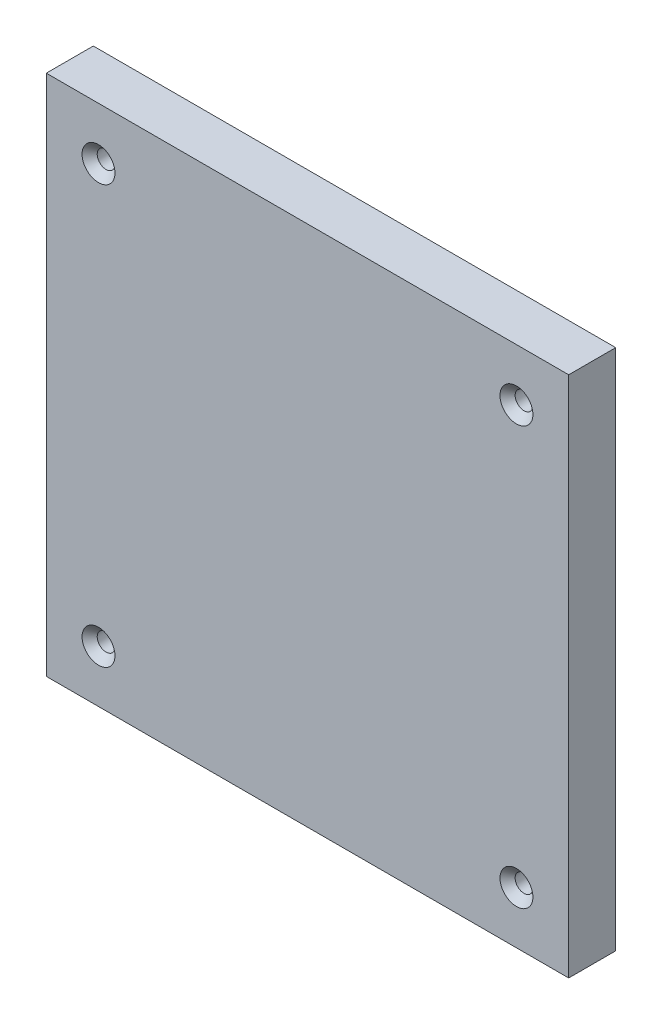
ISO-10303-21;
HEADER;
FILE_DESCRIPTION(('STEP AP214'),'2;1');
FILE_NAME('part.step','',(''),(''),'','','');
FILE_SCHEMA(('AUTOMOTIVE_DESIGN { 1 0 10303 214 1 1 1 1 }'));
ENDSEC;
DATA;
#1=APPLICATION_CONTEXT('core data for automotive mechanical design processes');
#2=APPLICATION_PROTOCOL_DEFINITION('international standard','automotive_design',2000,#1);
#3=PRODUCT_CONTEXT('',#1,'mechanical');
#4=PRODUCT('Part','Part','',(#3));
#5=PRODUCT_RELATED_PRODUCT_CATEGORY('part','',(#4));
#6=PRODUCT_DEFINITION_FORMATION('','',#4);
#7=PRODUCT_DEFINITION_CONTEXT('part definition',#1,'design');
#8=PRODUCT_DEFINITION('design','',#6,#7);
#9=PRODUCT_DEFINITION_SHAPE('','',#8);
#10=(LENGTH_UNIT() NAMED_UNIT(*) SI_UNIT(.MILLI.,.METRE.));
#11=(NAMED_UNIT(*) PLANE_ANGLE_UNIT() SI_UNIT($,.RADIAN.));
#12=(NAMED_UNIT(*) SI_UNIT($,.STERADIAN.) SOLID_ANGLE_UNIT());
#13=UNCERTAINTY_MEASURE_WITH_UNIT(LENGTH_MEASURE(1.E-05),#10,'distance_accuracy_value','');
#14=(GEOMETRIC_REPRESENTATION_CONTEXT(3) GLOBAL_UNCERTAINTY_ASSIGNED_CONTEXT((#13)) GLOBAL_UNIT_ASSIGNED_CONTEXT((#10,
#11,#12)) REPRESENTATION_CONTEXT('',''));
#15=CARTESIAN_POINT('',(0.,0.,0.));
#16=DIRECTION('',(0.,0.,1.));
#17=DIRECTION('',(1.,0.,0.));
#18=AXIS2_PLACEMENT_3D('',#15,#16,#17);
#19=CARTESIAN_POINT('',(50.,50.,9.));
#20=DIRECTION('',(-1.,0.,0.));
#21=DIRECTION('',(0.,-1.,0.));
#22=AXIS2_PLACEMENT_3D('',#19,#20,#21);
#23=PLANE('',#22);
#24=DIRECTION('',(0.,1.,0.));
#25=VECTOR('',#24,1.);
#26=CARTESIAN_POINT('',(50.,50.,0.));
#27=LINE('',#26,#25);
#28=CARTESIAN_POINT('',(50.,-50.,0.));
#29=VERTEX_POINT('',#28);
#30=CARTESIAN_POINT('',(50.,50.,0.));
#31=VERTEX_POINT('',#30);
#32=EDGE_CURVE('E114',#29,#31,#27,.T.);
#33=ORIENTED_EDGE('',*,*,#32,.T.);
#34=DIRECTION('',(0.,0.,-1.));
#35=VECTOR('',#34,1.);
#36=CARTESIAN_POINT('',(50.,50.,9.));
#37=LINE('',#36,#35);
#38=CARTESIAN_POINT('',(50.,50.,9.));
#39=VERTEX_POINT('',#38);
#40=EDGE_CURVE('E11',#39,#31,#37,.T.);
#41=ORIENTED_EDGE('',*,*,#40,.F.);
#42=DIRECTION('',(0.,1.,0.));
#43=VECTOR('',#42,1.);
#44=CARTESIAN_POINT('',(50.,50.,9.));
#45=LINE('',#44,#43);
#46=CARTESIAN_POINT('',(50.,-50.,9.));
#47=VERTEX_POINT('',#46);
#48=EDGE_CURVE('E98',#47,#39,#45,.T.);
#49=ORIENTED_EDGE('',*,*,#48,.F.);
#50=DIRECTION('',(0.,0.,-1.));
#51=VECTOR('',#50,1.);
#52=CARTESIAN_POINT('',(50.,-50.,9.));
#53=LINE('',#52,#51);
#54=EDGE_CURVE('E110',#47,#29,#53,.T.);
#55=ORIENTED_EDGE('',*,*,#54,.T.);
#56=EDGE_LOOP('',(#33,#41,#49,#55));
#57=FACE_BOUND('',#56,.T.);
#58=ADVANCED_FACE('F46',(#57),#23,.F.);
#59=CARTESIAN_POINT('',(-50.,50.,9.));
#60=DIRECTION('',(0.,-1.,0.));
#61=DIRECTION('',(0.,0.,-1.));
#62=AXIS2_PLACEMENT_3D('',#59,#60,#61);
#63=PLANE('',#62);
#64=DIRECTION('',(-1.,0.,0.));
#65=VECTOR('',#64,1.);
#66=CARTESIAN_POINT('',(-50.,50.,0.));
#67=LINE('',#66,#65);
#68=CARTESIAN_POINT('',(-50.,50.,0.));
#69=VERTEX_POINT('',#68);
#70=EDGE_CURVE('E103',#31,#69,#67,.T.);
#71=ORIENTED_EDGE('',*,*,#70,.T.);
#72=DIRECTION('',(0.,0.,-1.));
#73=VECTOR('',#72,1.);
#74=CARTESIAN_POINT('',(-50.,50.,9.));
#75=LINE('',#74,#73);
#76=CARTESIAN_POINT('',(-50.,50.,9.));
#77=VERTEX_POINT('',#76);
#78=EDGE_CURVE('E55',#77,#69,#75,.T.);
#79=ORIENTED_EDGE('',*,*,#78,.F.);
#80=DIRECTION('',(-1.,0.,0.));
#81=VECTOR('',#80,1.);
#82=CARTESIAN_POINT('',(-50.,50.,9.));
#83=LINE('',#82,#81);
#84=EDGE_CURVE('E93',#39,#77,#83,.T.);
#85=ORIENTED_EDGE('',*,*,#84,.F.);
#86=ORIENTED_EDGE('',*,*,#40,.T.);
#87=EDGE_LOOP('',(#71,#79,#85,#86));
#88=FACE_BOUND('',#87,.T.);
#89=ADVANCED_FACE('F102',(#88),#63,.F.);
#90=CARTESIAN_POINT('',(-50.,50.,9.));
#91=DIRECTION('',(1.,0.,0.));
#92=DIRECTION('',(0.,1.,0.));
#93=AXIS2_PLACEMENT_3D('',#90,#91,#92);
#94=PLANE('',#93);
#95=DIRECTION('',(0.,-1.,0.));
#96=VECTOR('',#95,1.);
#97=CARTESIAN_POINT('',(-50.,50.,0.));
#98=LINE('',#97,#96);
#99=CARTESIAN_POINT('',(-50.,-50.,0.));
#100=VERTEX_POINT('',#99);
#101=EDGE_CURVE('E80',#69,#100,#98,.T.);
#102=ORIENTED_EDGE('',*,*,#101,.T.);
#103=DIRECTION('',(0.,0.,-1.));
#104=VECTOR('',#103,1.);
#105=CARTESIAN_POINT('',(-50.,-50.,9.));
#106=LINE('',#105,#104);
#107=CARTESIAN_POINT('',(-50.,-50.,9.));
#108=VERTEX_POINT('',#107);
#109=EDGE_CURVE('E105',#108,#100,#106,.T.);
#110=ORIENTED_EDGE('',*,*,#109,.F.);
#111=DIRECTION('',(0.,-1.,0.));
#112=VECTOR('',#111,1.);
#113=CARTESIAN_POINT('',(-50.,50.,9.));
#114=LINE('',#113,#112);
#115=EDGE_CURVE('E96',#77,#108,#114,.T.);
#116=ORIENTED_EDGE('',*,*,#115,.F.);
#117=ORIENTED_EDGE('',*,*,#78,.T.);
#118=EDGE_LOOP('',(#102,#110,#116,#117));
#119=FACE_BOUND('',#118,.T.);
#120=ADVANCED_FACE('F106',(#119),#94,.F.);
#121=CARTESIAN_POINT('',(-50.,-50.,9.));
#122=DIRECTION('',(0.,1.,0.));
#123=DIRECTION('',(0.,0.,1.));
#124=AXIS2_PLACEMENT_3D('',#121,#122,#123);
#125=PLANE('',#124);
#126=DIRECTION('',(1.,0.,0.));
#127=VECTOR('',#126,1.);
#128=CARTESIAN_POINT('',(-50.,-50.,0.));
#129=LINE('',#128,#127);
#130=EDGE_CURVE('E86',#100,#29,#129,.T.);
#131=ORIENTED_EDGE('',*,*,#130,.T.);
#132=ORIENTED_EDGE('',*,*,#54,.F.);
#133=DIRECTION('',(1.,0.,0.));
#134=VECTOR('',#133,1.);
#135=CARTESIAN_POINT('',(-50.,-50.,9.));
#136=LINE('',#135,#134);
#137=EDGE_CURVE('E63',#108,#47,#136,.T.);
#138=ORIENTED_EDGE('',*,*,#137,.F.);
#139=ORIENTED_EDGE('',*,*,#109,.T.);
#140=EDGE_LOOP('',(#131,#132,#138,#139));
#141=FACE_BOUND('',#140,.T.);
#142=ADVANCED_FACE('F128',(#141),#125,.F.);
#143=CARTESIAN_POINT('',(0.,0.,9.));
#144=DIRECTION('',(0.,0.,1.));
#145=DIRECTION('',(1.,0.,0.));
#146=AXIS2_PLACEMENT_3D('',#143,#144,#145);
#147=PLANE('',#146);
#148=CARTESIAN_POINT('',(-40.,40.,9.));
#149=DIRECTION('',(0.,0.,1.));
#150=DIRECTION('',(1.,0.,0.));
#151=AXIS2_PLACEMENT_3D('',#148,#149,#150);
#152=CIRCLE('',#151,3.15);
#153=CARTESIAN_POINT('',(-36.85,40.,9.));
#154=VERTEX_POINT('',#153);
#155=EDGE_CURVE('E190',#154,#154,#152,.T.);
#156=ORIENTED_EDGE('',*,*,#155,.F.);
#157=EDGE_LOOP('',(#156));
#158=FACE_BOUND('',#157,.T.);
#159=CARTESIAN_POINT('',(40.,40.,9.));
#160=DIRECTION('',(0.,0.,1.));
#161=DIRECTION('',(1.,0.,0.));
#162=AXIS2_PLACEMENT_3D('',#159,#160,#161);
#163=CIRCLE('',#162,3.15);
#164=CARTESIAN_POINT('',(43.15,40.,9.));
#165=VERTEX_POINT('',#164);
#166=EDGE_CURVE('E174',#165,#165,#163,.T.);
#167=ORIENTED_EDGE('',*,*,#166,.F.);
#168=EDGE_LOOP('',(#167));
#169=FACE_BOUND('',#168,.T.);
#170=CARTESIAN_POINT('',(40.,-40.,9.));
#171=DIRECTION('',(0.,0.,1.));
#172=DIRECTION('',(1.,0.,0.));
#173=AXIS2_PLACEMENT_3D('',#170,#171,#172);
#174=CIRCLE('',#173,3.15);
#175=CARTESIAN_POINT('',(43.15,-40.,9.));
#176=VERTEX_POINT('',#175);
#177=EDGE_CURVE('E158',#176,#176,#174,.T.);
#178=ORIENTED_EDGE('',*,*,#177,.F.);
#179=EDGE_LOOP('',(#178));
#180=FACE_BOUND('',#179,.T.);
#181=CARTESIAN_POINT('',(-40.,-40.,9.));
#182=DIRECTION('',(0.,0.,1.));
#183=DIRECTION('',(1.,0.,0.));
#184=AXIS2_PLACEMENT_3D('',#181,#182,#183);
#185=CIRCLE('',#184,3.15);
#186=CARTESIAN_POINT('',(-36.85,-40.,9.));
#187=VERTEX_POINT('',#186);
#188=EDGE_CURVE('E142',#187,#187,#185,.T.);
#189=ORIENTED_EDGE('',*,*,#188,.F.);
#190=EDGE_LOOP('',(#189));
#191=FACE_BOUND('',#190,.T.);
#192=ORIENTED_EDGE('',*,*,#48,.T.);
#193=ORIENTED_EDGE('',*,*,#84,.T.);
#194=ORIENTED_EDGE('',*,*,#115,.T.);
#195=ORIENTED_EDGE('',*,*,#137,.T.);
#196=EDGE_LOOP('',(#192,#193,#194,#195));
#197=FACE_BOUND('',#196,.T.);
#198=ADVANCED_FACE('F94',(#158,#169,#180,#191,#197),#147,.T.);
#199=CARTESIAN_POINT('',(0.,0.,0.));
#200=DIRECTION('',(0.,0.,1.));
#201=DIRECTION('',(1.,0.,0.));
#202=AXIS2_PLACEMENT_3D('',#199,#200,#201);
#203=PLANE('',#202);
#204=CARTESIAN_POINT('',(-40.,40.,0.));
#205=DIRECTION('',(0.,0.,1.));
#206=DIRECTION('',(1.,0.,0.));
#207=AXIS2_PLACEMENT_3D('',#204,#205,#206);
#208=CIRCLE('',#207,1.725);
#209=CARTESIAN_POINT('',(-38.275,40.,0.));
#210=VERTEX_POINT('',#209);
#211=EDGE_CURVE('E194',#210,#210,#208,.T.);
#212=ORIENTED_EDGE('',*,*,#211,.T.);
#213=EDGE_LOOP('',(#212));
#214=FACE_BOUND('',#213,.T.);
#215=CARTESIAN_POINT('',(40.,40.,0.));
#216=DIRECTION('',(0.,0.,1.));
#217=DIRECTION('',(1.,0.,0.));
#218=AXIS2_PLACEMENT_3D('',#215,#216,#217);
#219=CIRCLE('',#218,1.725);
#220=CARTESIAN_POINT('',(41.725,40.,0.));
#221=VERTEX_POINT('',#220);
#222=EDGE_CURVE('E178',#221,#221,#219,.T.);
#223=ORIENTED_EDGE('',*,*,#222,.T.);
#224=EDGE_LOOP('',(#223));
#225=FACE_BOUND('',#224,.T.);
#226=CARTESIAN_POINT('',(40.,-40.,0.));
#227=DIRECTION('',(0.,0.,1.));
#228=DIRECTION('',(1.,0.,0.));
#229=AXIS2_PLACEMENT_3D('',#226,#227,#228);
#230=CIRCLE('',#229,1.725);
#231=CARTESIAN_POINT('',(41.725,-40.,0.));
#232=VERTEX_POINT('',#231);
#233=EDGE_CURVE('E162',#232,#232,#230,.T.);
#234=ORIENTED_EDGE('',*,*,#233,.T.);
#235=EDGE_LOOP('',(#234));
#236=FACE_BOUND('',#235,.T.);
#237=CARTESIAN_POINT('',(-40.,-40.,0.));
#238=DIRECTION('',(0.,0.,1.));
#239=DIRECTION('',(1.,0.,0.));
#240=AXIS2_PLACEMENT_3D('',#237,#238,#239);
#241=CIRCLE('',#240,1.725);
#242=CARTESIAN_POINT('',(-38.275,-40.,0.));
#243=VERTEX_POINT('',#242);
#244=EDGE_CURVE('E146',#243,#243,#241,.T.);
#245=ORIENTED_EDGE('',*,*,#244,.T.);
#246=EDGE_LOOP('',(#245));
#247=FACE_BOUND('',#246,.T.);
#248=ORIENTED_EDGE('',*,*,#32,.F.);
#249=ORIENTED_EDGE('',*,*,#130,.F.);
#250=ORIENTED_EDGE('',*,*,#101,.F.);
#251=ORIENTED_EDGE('',*,*,#70,.F.);
#252=EDGE_LOOP('',(#248,#249,#250,#251));
#253=FACE_BOUND('',#252,.T.);
#254=ADVANCED_FACE('F131',(#214,#225,#236,#247,#253),#203,.F.);
#255=CARTESIAN_POINT('',(-40.,-40.,0.024999999999999));
#256=DIRECTION('',(0.,0.,-1.));
#257=DIRECTION('',(-1.,0.,0.));
#258=AXIS2_PLACEMENT_3D('',#255,#256,#257);
#259=CONICAL_SURFACE('',#258,1.7,0.785398163397414);
#260=ORIENTED_EDGE('',*,*,#244,.F.);
#261=EDGE_LOOP('',(#260));
#262=FACE_BOUND('',#261,.T.);
#263=CARTESIAN_POINT('',(-40.,-40.,0.024999999999999));
#264=DIRECTION('',(0.,0.,1.));
#265=DIRECTION('',(1.,0.,0.));
#266=AXIS2_PLACEMENT_3D('',#263,#264,#265);
#267=CIRCLE('',#266,1.7);
#268=CARTESIAN_POINT('',(-38.3,-40.,0.024999999999999));
#269=VERTEX_POINT('',#268);
#270=EDGE_CURVE('E118',#269,#269,#267,.T.);
#271=ORIENTED_EDGE('',*,*,#270,.T.);
#272=EDGE_LOOP('',(#271));
#273=FACE_BOUND('',#272,.T.);
#274=ADVANCED_FACE('F242',(#262,#273),#259,.F.);
#275=CARTESIAN_POINT('',(-40.,-40.,9.));
#276=DIRECTION('',(0.,0.,1.));
#277=DIRECTION('',(1.,0.,0.));
#278=AXIS2_PLACEMENT_3D('',#275,#276,#277);
#279=CYLINDRICAL_SURFACE('',#278,1.7);
#280=ORIENTED_EDGE('',*,*,#270,.F.);
#281=EDGE_LOOP('',(#280));
#282=FACE_BOUND('',#281,.T.);
#283=CARTESIAN_POINT('',(-40.,-40.,7.55));
#284=DIRECTION('',(0.,0.,1.));
#285=DIRECTION('',(1.,0.,0.));
#286=AXIS2_PLACEMENT_3D('',#283,#284,#285);
#287=CIRCLE('',#286,1.7);
#288=CARTESIAN_POINT('',(-38.3,-40.,7.55));
#289=VERTEX_POINT('',#288);
#290=EDGE_CURVE('E138',#289,#289,#287,.T.);
#291=ORIENTED_EDGE('',*,*,#290,.T.);
#292=EDGE_LOOP('',(#291));
#293=FACE_BOUND('',#292,.T.);
#294=ADVANCED_FACE('F232',(#282,#293),#279,.F.);
#295=CARTESIAN_POINT('',(-40.,-40.,9.));
#296=DIRECTION('',(0.,0.,1.));
#297=DIRECTION('',(1.,0.,0.));
#298=AXIS2_PLACEMENT_3D('',#295,#296,#297);
#299=CONICAL_SURFACE('',#298,3.15,0.785398163397448);
#300=ORIENTED_EDGE('',*,*,#290,.F.);
#301=EDGE_LOOP('',(#300));
#302=FACE_BOUND('',#301,.T.);
#303=ORIENTED_EDGE('',*,*,#188,.T.);
#304=EDGE_LOOP('',(#303));
#305=FACE_BOUND('',#304,.T.);
#306=ADVANCED_FACE('F229',(#302,#305),#299,.F.);
#307=CARTESIAN_POINT('',(40.,-40.,0.024999999999999));
#308=DIRECTION('',(0.,0.,-1.));
#309=DIRECTION('',(-1.,0.,0.));
#310=AXIS2_PLACEMENT_3D('',#307,#308,#309);
#311=CONICAL_SURFACE('',#310,1.7,0.785398163397414);
#312=ORIENTED_EDGE('',*,*,#233,.F.);
#313=EDGE_LOOP('',(#312));
#314=FACE_BOUND('',#313,.T.);
#315=CARTESIAN_POINT('',(40.,-40.,0.024999999999999));
#316=DIRECTION('',(0.,0.,1.));
#317=DIRECTION('',(1.,0.,0.));
#318=AXIS2_PLACEMENT_3D('',#315,#316,#317);
#319=CIRCLE('',#318,1.7);
#320=CARTESIAN_POINT('',(41.7,-40.,0.024999999999999));
#321=VERTEX_POINT('',#320);
#322=EDGE_CURVE('E150',#321,#321,#319,.T.);
#323=ORIENTED_EDGE('',*,*,#322,.T.);
#324=EDGE_LOOP('',(#323));
#325=FACE_BOUND('',#324,.T.);
#326=ADVANCED_FACE('F231',(#314,#325),#311,.F.);
#327=CARTESIAN_POINT('',(40.,-40.,9.));
#328=DIRECTION('',(0.,0.,1.));
#329=DIRECTION('',(1.,0.,0.));
#330=AXIS2_PLACEMENT_3D('',#327,#328,#329);
#331=CYLINDRICAL_SURFACE('',#330,1.7);
#332=ORIENTED_EDGE('',*,*,#322,.F.);
#333=EDGE_LOOP('',(#332));
#334=FACE_BOUND('',#333,.T.);
#335=CARTESIAN_POINT('',(40.,-40.,7.55));
#336=DIRECTION('',(0.,0.,1.));
#337=DIRECTION('',(1.,0.,0.));
#338=AXIS2_PLACEMENT_3D('',#335,#336,#337);
#339=CIRCLE('',#338,1.7);
#340=CARTESIAN_POINT('',(41.7,-40.,7.55));
#341=VERTEX_POINT('',#340);
#342=EDGE_CURVE('E154',#341,#341,#339,.T.);
#343=ORIENTED_EDGE('',*,*,#342,.T.);
#344=EDGE_LOOP('',(#343));
#345=FACE_BOUND('',#344,.T.);
#346=ADVANCED_FACE('F239',(#334,#345),#331,.F.);
#347=CARTESIAN_POINT('',(40.,-40.,9.));
#348=DIRECTION('',(0.,0.,1.));
#349=DIRECTION('',(1.,0.,0.));
#350=AXIS2_PLACEMENT_3D('',#347,#348,#349);
#351=CONICAL_SURFACE('',#350,3.15,0.785398163397448);
#352=ORIENTED_EDGE('',*,*,#342,.F.);
#353=EDGE_LOOP('',(#352));
#354=FACE_BOUND('',#353,.T.);
#355=ORIENTED_EDGE('',*,*,#177,.T.);
#356=EDGE_LOOP('',(#355));
#357=FACE_BOUND('',#356,.T.);
#358=ADVANCED_FACE('F296',(#354,#357),#351,.F.);
#359=CARTESIAN_POINT('',(40.,40.,0.024999999999999));
#360=DIRECTION('',(0.,0.,-1.));
#361=DIRECTION('',(-1.,0.,0.));
#362=AXIS2_PLACEMENT_3D('',#359,#360,#361);
#363=CONICAL_SURFACE('',#362,1.7,0.785398163397414);
#364=ORIENTED_EDGE('',*,*,#222,.F.);
#365=EDGE_LOOP('',(#364));
#366=FACE_BOUND('',#365,.T.);
#367=CARTESIAN_POINT('',(40.,40.,0.024999999999999));
#368=DIRECTION('',(0.,0.,1.));
#369=DIRECTION('',(1.,0.,0.));
#370=AXIS2_PLACEMENT_3D('',#367,#368,#369);
#371=CIRCLE('',#370,1.7);
#372=CARTESIAN_POINT('',(41.7,40.,0.024999999999999));
#373=VERTEX_POINT('',#372);
#374=EDGE_CURVE('E166',#373,#373,#371,.T.);
#375=ORIENTED_EDGE('',*,*,#374,.T.);
#376=EDGE_LOOP('',(#375));
#377=FACE_BOUND('',#376,.T.);
#378=ADVANCED_FACE('F307',(#366,#377),#363,.F.);
#379=CARTESIAN_POINT('',(40.,40.,9.));
#380=DIRECTION('',(0.,0.,1.));
#381=DIRECTION('',(1.,0.,0.));
#382=AXIS2_PLACEMENT_3D('',#379,#380,#381);
#383=CYLINDRICAL_SURFACE('',#382,1.7);
#384=ORIENTED_EDGE('',*,*,#374,.F.);
#385=EDGE_LOOP('',(#384));
#386=FACE_BOUND('',#385,.T.);
#387=CARTESIAN_POINT('',(40.,40.,7.55));
#388=DIRECTION('',(0.,0.,1.));
#389=DIRECTION('',(1.,0.,0.));
#390=AXIS2_PLACEMENT_3D('',#387,#388,#389);
#391=CIRCLE('',#390,1.7);
#392=CARTESIAN_POINT('',(41.7,40.,7.55));
#393=VERTEX_POINT('',#392);
#394=EDGE_CURVE('E170',#393,#393,#391,.T.);
#395=ORIENTED_EDGE('',*,*,#394,.T.);
#396=EDGE_LOOP('',(#395));
#397=FACE_BOUND('',#396,.T.);
#398=ADVANCED_FACE('F318',(#386,#397),#383,.F.);
#399=CARTESIAN_POINT('',(40.,40.,9.));
#400=DIRECTION('',(0.,0.,1.));
#401=DIRECTION('',(1.,0.,0.));
#402=AXIS2_PLACEMENT_3D('',#399,#400,#401);
#403=CONICAL_SURFACE('',#402,3.15,0.785398163397448);
#404=ORIENTED_EDGE('',*,*,#394,.F.);
#405=EDGE_LOOP('',(#404));
#406=FACE_BOUND('',#405,.T.);
#407=ORIENTED_EDGE('',*,*,#166,.T.);
#408=EDGE_LOOP('',(#407));
#409=FACE_BOUND('',#408,.T.);
#410=ADVANCED_FACE('F205',(#406,#409),#403,.F.);
#411=CARTESIAN_POINT('',(-40.,40.,0.024999999999999));
#412=DIRECTION('',(0.,0.,-1.));
#413=DIRECTION('',(-1.,0.,0.));
#414=AXIS2_PLACEMENT_3D('',#411,#412,#413);
#415=CONICAL_SURFACE('',#414,1.7,0.785398163397414);
#416=ORIENTED_EDGE('',*,*,#211,.F.);
#417=EDGE_LOOP('',(#416));
#418=FACE_BOUND('',#417,.T.);
#419=CARTESIAN_POINT('',(-40.,40.,0.024999999999999));
#420=DIRECTION('',(0.,0.,1.));
#421=DIRECTION('',(1.,0.,0.));
#422=AXIS2_PLACEMENT_3D('',#419,#420,#421);
#423=CIRCLE('',#422,1.7);
#424=CARTESIAN_POINT('',(-38.3,40.,0.024999999999999));
#425=VERTEX_POINT('',#424);
#426=EDGE_CURVE('E182',#425,#425,#423,.T.);
#427=ORIENTED_EDGE('',*,*,#426,.T.);
#428=EDGE_LOOP('',(#427));
#429=FACE_BOUND('',#428,.T.);
#430=ADVANCED_FACE('F201',(#418,#429),#415,.F.);
#431=CARTESIAN_POINT('',(-40.,40.,9.));
#432=DIRECTION('',(0.,0.,1.));
#433=DIRECTION('',(1.,0.,0.));
#434=AXIS2_PLACEMENT_3D('',#431,#432,#433);
#435=CYLINDRICAL_SURFACE('',#434,1.7);
#436=ORIENTED_EDGE('',*,*,#426,.F.);
#437=EDGE_LOOP('',(#436));
#438=FACE_BOUND('',#437,.T.);
#439=CARTESIAN_POINT('',(-40.,40.,7.55));
#440=DIRECTION('',(0.,0.,1.));
#441=DIRECTION('',(1.,0.,0.));
#442=AXIS2_PLACEMENT_3D('',#439,#440,#441);
#443=CIRCLE('',#442,1.7);
#444=CARTESIAN_POINT('',(-38.3,40.,7.55));
#445=VERTEX_POINT('',#444);
#446=EDGE_CURVE('E186',#445,#445,#443,.T.);
#447=ORIENTED_EDGE('',*,*,#446,.T.);
#448=EDGE_LOOP('',(#447));
#449=FACE_BOUND('',#448,.T.);
#450=ADVANCED_FACE('F204',(#438,#449),#435,.F.);
#451=CARTESIAN_POINT('',(-40.,40.,9.));
#452=DIRECTION('',(0.,0.,1.));
#453=DIRECTION('',(1.,0.,0.));
#454=AXIS2_PLACEMENT_3D('',#451,#452,#453);
#455=CONICAL_SURFACE('',#454,3.15,0.785398163397448);
#456=ORIENTED_EDGE('',*,*,#446,.F.);
#457=EDGE_LOOP('',(#456));
#458=FACE_BOUND('',#457,.T.);
#459=ORIENTED_EDGE('',*,*,#155,.T.);
#460=EDGE_LOOP('',(#459));
#461=FACE_BOUND('',#460,.T.);
#462=ADVANCED_FACE('F211',(#458,#461),#455,.F.);
#463=CLOSED_SHELL('',(#58,#89,#120,#142,#198,#254,#274,#294,#306,#326,#346,#358,#378,#398,#410,
#430,#450,#462));
#464=MANIFOLD_SOLID_BREP('B2',#463);
#465=ADVANCED_BREP_SHAPE_REPRESENTATION('',(#18,#464),#14);
#466=SHAPE_DEFINITION_REPRESENTATION(#9,#465);
ENDSEC;
END-ISO-10303-21;
